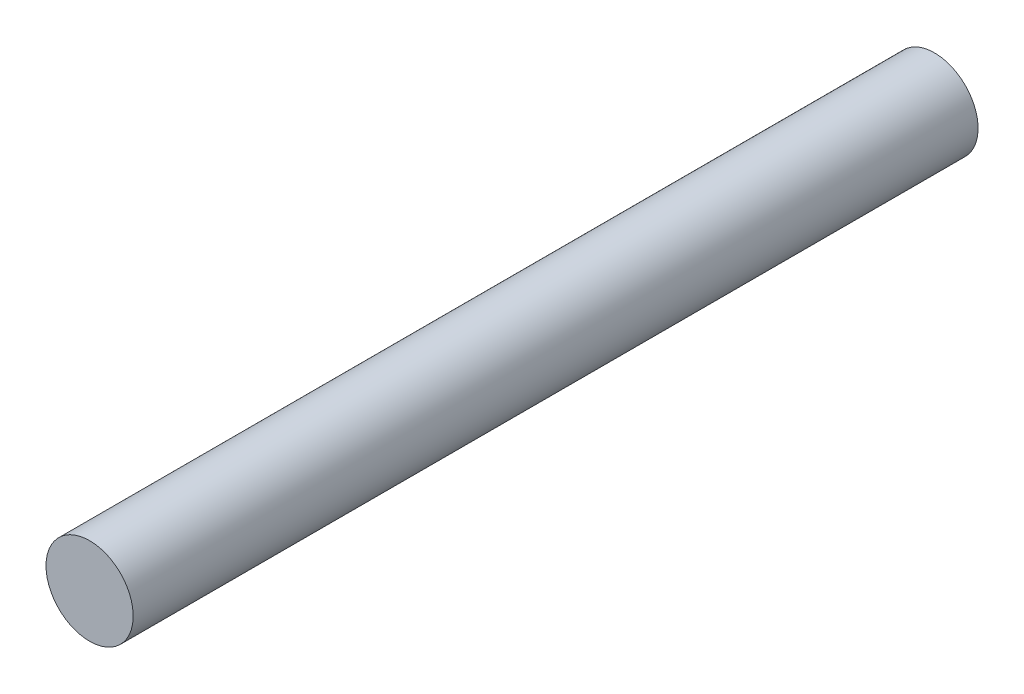
ISO-10303-21;
HEADER;
FILE_DESCRIPTION(('STEP AP214'),'2;1');
FILE_NAME('part.step','',(''),(''),'','','');
FILE_SCHEMA(('AUTOMOTIVE_DESIGN { 1 0 10303 214 1 1 1 1 }'));
ENDSEC;
DATA;
#1=APPLICATION_CONTEXT('core data for automotive mechanical design processes');
#2=APPLICATION_PROTOCOL_DEFINITION('international standard','automotive_design',2000,#1);
#3=PRODUCT_CONTEXT('',#1,'mechanical');
#4=PRODUCT('Part','Part','',(#3));
#5=PRODUCT_RELATED_PRODUCT_CATEGORY('part','',(#4));
#6=PRODUCT_DEFINITION_FORMATION('','',#4);
#7=PRODUCT_DEFINITION_CONTEXT('part definition',#1,'design');
#8=PRODUCT_DEFINITION('design','',#6,#7);
#9=PRODUCT_DEFINITION_SHAPE('','',#8);
#10=(LENGTH_UNIT() NAMED_UNIT(*) SI_UNIT(.MILLI.,.METRE.));
#11=(NAMED_UNIT(*) PLANE_ANGLE_UNIT() SI_UNIT($,.RADIAN.));
#12=(NAMED_UNIT(*) SI_UNIT($,.STERADIAN.) SOLID_ANGLE_UNIT());
#13=UNCERTAINTY_MEASURE_WITH_UNIT(LENGTH_MEASURE(1.E-05),#10,'distance_accuracy_value','');
#14=(GEOMETRIC_REPRESENTATION_CONTEXT(3) GLOBAL_UNCERTAINTY_ASSIGNED_CONTEXT((#13)) GLOBAL_UNIT_ASSIGNED_CONTEXT((#10,
#11,#12)) REPRESENTATION_CONTEXT('',''));
#15=CARTESIAN_POINT('',(0.,0.,0.));
#16=DIRECTION('',(0.,0.,1.));
#17=DIRECTION('',(1.,0.,0.));
#18=AXIS2_PLACEMENT_3D('',#15,#16,#17);
#19=CARTESIAN_POINT('',(0.,0.,123.063));
#20=DIRECTION('',(0.,0.,-1.));
#21=DIRECTION('',(-1.,0.,0.));
#22=AXIS2_PLACEMENT_3D('',#19,#20,#21);
#23=CYLINDRICAL_SURFACE('',#22,6.35);
#24=CARTESIAN_POINT('',(0.,0.,123.063));
#25=DIRECTION('',(0.,0.,1.));
#26=DIRECTION('',(1.,0.,0.));
#27=AXIS2_PLACEMENT_3D('',#24,#25,#26);
#28=CIRCLE('',#27,6.35);
#29=CARTESIAN_POINT('',(-6.35,0.,123.063));
#30=VERTEX_POINT('',#29);
#31=EDGE_CURVE('E10',#30,#30,#28,.T.);
#32=CARTESIAN_POINT('',(0.,0.,0.));
#33=DIRECTION('',(0.,0.,1.));
#34=DIRECTION('',(1.,0.,0.));
#35=AXIS2_PLACEMENT_3D('',#32,#33,#34);
#36=CIRCLE('',#35,6.35);
#37=CARTESIAN_POINT('',(-6.35,0.,0.));
#38=VERTEX_POINT('',#37);
#39=EDGE_CURVE('E46',#38,#38,#36,.T.);
#40=CARTESIAN_POINT('',(-6.35,0.,123.063));
#41=CARTESIAN_POINT('',(-6.35,0.,121.78109375));
#42=CARTESIAN_POINT('',(-6.35,0.,120.4991875));
#43=CARTESIAN_POINT('',(-6.35,0.,117.935375));
#44=CARTESIAN_POINT('',(-6.35,0.,116.65346875));
#45=CARTESIAN_POINT('',(-6.35,0.,114.08965625));
#46=CARTESIAN_POINT('',(-6.35,0.,112.80775));
#47=CARTESIAN_POINT('',(-6.35,0.,110.2439375));
#48=CARTESIAN_POINT('',(-6.35,0.,108.96203125));
#49=CARTESIAN_POINT('',(-6.35,0.,106.39821875));
#50=CARTESIAN_POINT('',(-6.35,0.,105.1163125));
#51=CARTESIAN_POINT('',(-6.35,0.,102.5525));
#52=CARTESIAN_POINT('',(-6.35,0.,101.27059375));
#53=CARTESIAN_POINT('',(-6.35,0.,98.70678125));
#54=CARTESIAN_POINT('',(-6.35,0.,97.424875));
#55=CARTESIAN_POINT('',(-6.35,0.,94.8610625));
#56=CARTESIAN_POINT('',(-6.35,0.,93.57915625));
#57=CARTESIAN_POINT('',(-6.35,0.,91.01534375));
#58=CARTESIAN_POINT('',(-6.35,0.,89.7334375));
#59=CARTESIAN_POINT('',(-6.35,0.,87.169625));
#60=CARTESIAN_POINT('',(-6.35,0.,85.88771875));
#61=CARTESIAN_POINT('',(-6.35,0.,83.32390625));
#62=CARTESIAN_POINT('',(-6.35,0.,82.042));
#63=CARTESIAN_POINT('',(-6.35,0.,79.4781875));
#64=CARTESIAN_POINT('',(-6.35,0.,78.19628125));
#65=CARTESIAN_POINT('',(-6.35,0.,75.63246875));
#66=CARTESIAN_POINT('',(-6.35,0.,74.3505625));
#67=CARTESIAN_POINT('',(-6.35,0.,71.78675));
#68=CARTESIAN_POINT('',(-6.35,0.,70.50484375));
#69=CARTESIAN_POINT('',(-6.35,0.,67.94103125));
#70=CARTESIAN_POINT('',(-6.35,0.,66.659125));
#71=CARTESIAN_POINT('',(-6.35,0.,64.0953125));
#72=CARTESIAN_POINT('',(-6.35,0.,62.81340625));
#73=CARTESIAN_POINT('',(-6.35,0.,60.24959375));
#74=CARTESIAN_POINT('',(-6.35,0.,58.9676875));
#75=CARTESIAN_POINT('',(-6.35,0.,56.403875));
#76=CARTESIAN_POINT('',(-6.35,0.,55.12196875));
#77=CARTESIAN_POINT('',(-6.35,0.,52.55815625));
#78=CARTESIAN_POINT('',(-6.35,0.,51.27625));
#79=CARTESIAN_POINT('',(-6.35,0.,48.7124375));
#80=CARTESIAN_POINT('',(-6.35,0.,47.43053125));
#81=CARTESIAN_POINT('',(-6.35,0.,44.86671875));
#82=CARTESIAN_POINT('',(-6.35,0.,43.5848125));
#83=CARTESIAN_POINT('',(-6.35,0.,41.021));
#84=CARTESIAN_POINT('',(-6.35,0.,39.73909375));
#85=CARTESIAN_POINT('',(-6.35,0.,37.17528125));
#86=CARTESIAN_POINT('',(-6.35,0.,35.893375));
#87=CARTESIAN_POINT('',(-6.35,0.,33.3295625));
#88=CARTESIAN_POINT('',(-6.35,0.,32.04765625));
#89=CARTESIAN_POINT('',(-6.35,0.,29.48384375));
#90=CARTESIAN_POINT('',(-6.35,0.,28.2019375));
#91=CARTESIAN_POINT('',(-6.35,0.,25.638125));
#92=CARTESIAN_POINT('',(-6.35,0.,24.35621875));
#93=CARTESIAN_POINT('',(-6.35,0.,21.79240625));
#94=CARTESIAN_POINT('',(-6.35,0.,20.5105));
#95=CARTESIAN_POINT('',(-6.35,0.,17.9466875));
#96=CARTESIAN_POINT('',(-6.35,0.,16.66478125));
#97=CARTESIAN_POINT('',(-6.35,0.,14.10096875));
#98=CARTESIAN_POINT('',(-6.35,0.,12.8190625));
#99=CARTESIAN_POINT('',(-6.35,0.,10.25525));
#100=CARTESIAN_POINT('',(-6.35,0.,8.97334375));
#101=CARTESIAN_POINT('',(-6.35,0.,6.40953125));
#102=CARTESIAN_POINT('',(-6.35,0.,5.127625));
#103=CARTESIAN_POINT('',(-6.35,0.,2.5638125));
#104=CARTESIAN_POINT('',(-6.35,0.,1.28190625));
#105=CARTESIAN_POINT('',(-6.35,0.,0.));
#106=B_SPLINE_CURVE_WITH_KNOTS('',3,(#40,#41,#42,#43,#44,#45,#46,#47,#48,#49,#50,#51,#52,#53,
#54,#55,#56,#57,#58,#59,#60,#61,#62,#63,#64,#65,#66,#67,#68,#69,#70,#71,#72,#73,#74,#75,#76,#77,
#78,#79,#80,#81,#82,#83,#84,#85,#86,#87,#88,#89,#90,#91,#92,#93,#94,#95,#96,#97,#98,#99,#100,
#101,#102,#103,#104,#105),.UNSPECIFIED.,.F.,.F.,(4,2,2,2,2,2,2,2,2,2,2,2,2,2,2,2,2,2,2,2,2,2,2,
2,2,2,2,2,2,2,2,2,4),(0.,3.84571875,7.69143750000001,11.53715625,15.382875,19.22859375,
23.0743125,26.92003125,30.76575,34.61146875,38.4571875,42.30290625,46.148625,49.99434375,
53.8400625,57.68578125,61.5315,65.37721875,69.2229375,73.06865625,76.914375,80.76009375,
84.6058125,88.45153125,92.29725,96.14296875,99.9886875,103.83440625,107.680125,111.52584375,
115.3715625,119.21728125,123.063),.UNSPECIFIED.);
#107=EDGE_CURVE('BSEAM43',#30,#38,#106,.T.);
#108=ORIENTED_EDGE('',*,*,#31,.F.);
#109=ORIENTED_EDGE('',*,*,#39,.T.);
#110=ORIENTED_EDGE('',*,*,#107,.T.);
#111=ORIENTED_EDGE('',*,*,#107,.F.);
#112=EDGE_LOOP('',(#108,#110,#109,#111));
#113=FACE_BOUND('',#112,.T.);
#114=ADVANCED_FACE('F43',(#113),#23,.T.);
#115=CARTESIAN_POINT('',(0.,0.,123.063));
#116=DIRECTION('',(0.,0.,1.));
#117=DIRECTION('',(1.,0.,0.));
#118=AXIS2_PLACEMENT_3D('',#115,#116,#117);
#119=PLANE('',#118);
#120=ORIENTED_EDGE('',*,*,#31,.T.);
#121=EDGE_LOOP('',(#120));
#122=FACE_BOUND('',#121,.T.);
#123=ADVANCED_FACE('F60',(#122),#119,.T.);
#124=CARTESIAN_POINT('',(0.,0.,0.));
#125=DIRECTION('',(0.,0.,1.));
#126=DIRECTION('',(1.,0.,0.));
#127=AXIS2_PLACEMENT_3D('',#124,#125,#126);
#128=PLANE('',#127);
#129=ORIENTED_EDGE('',*,*,#39,.F.);
#130=EDGE_LOOP('',(#129));
#131=FACE_BOUND('',#130,.T.);
#132=ADVANCED_FACE('F58',(#131),#128,.F.);
#133=CLOSED_SHELL('',(#114,#123,#132));
#134=MANIFOLD_SOLID_BREP('B2',#133);
#135=ADVANCED_BREP_SHAPE_REPRESENTATION('',(#18,#134),#14);
#136=SHAPE_DEFINITION_REPRESENTATION(#9,#135);
ENDSEC;
END-ISO-10303-21;
